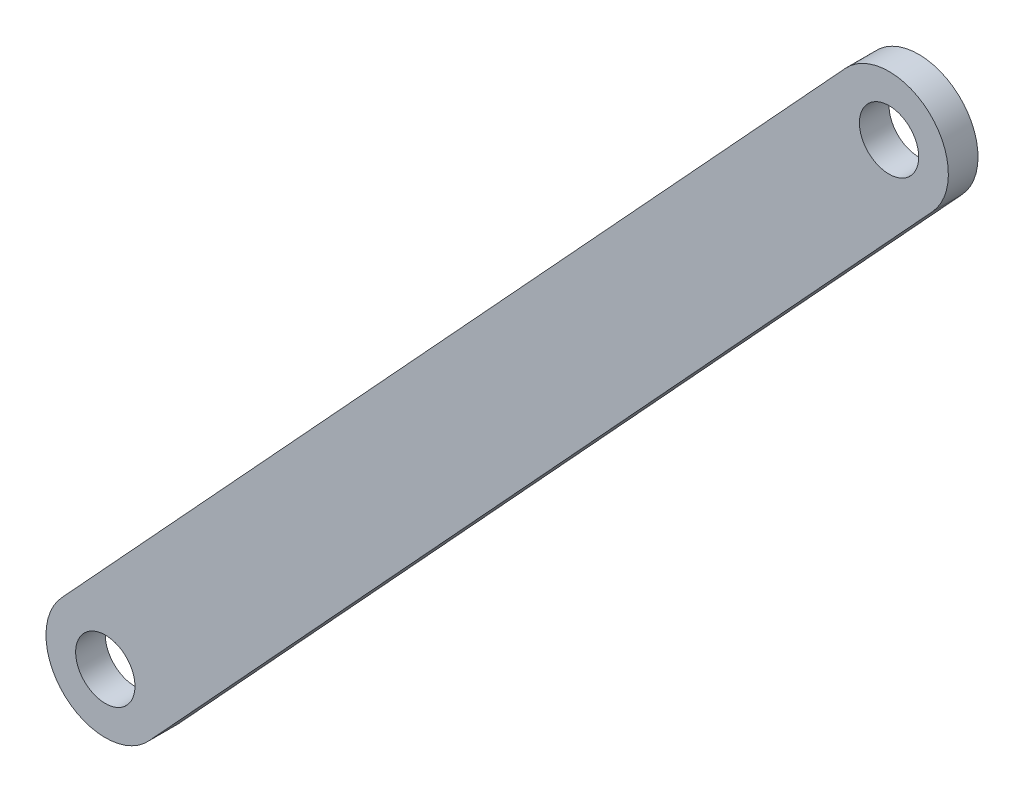
ISO-10303-21;
HEADER;
FILE_DESCRIPTION(('STEP AP214'),'2;1');
FILE_NAME('part.step','',(''),(''),'','','');
FILE_SCHEMA(('AUTOMOTIVE_DESIGN { 1 0 10303 214 1 1 1 1 }'));
ENDSEC;
DATA;
#1=APPLICATION_CONTEXT('core data for automotive mechanical design processes');
#2=APPLICATION_PROTOCOL_DEFINITION('international standard','automotive_design',2000,#1);
#3=PRODUCT_CONTEXT('',#1,'mechanical');
#4=PRODUCT('Part','Part','',(#3));
#5=PRODUCT_RELATED_PRODUCT_CATEGORY('part','',(#4));
#6=PRODUCT_DEFINITION_FORMATION('','',#4);
#7=PRODUCT_DEFINITION_CONTEXT('part definition',#1,'design');
#8=PRODUCT_DEFINITION('design','',#6,#7);
#9=PRODUCT_DEFINITION_SHAPE('','',#8);
#10=(LENGTH_UNIT() NAMED_UNIT(*) SI_UNIT(.MILLI.,.METRE.));
#11=(NAMED_UNIT(*) PLANE_ANGLE_UNIT() SI_UNIT($,.RADIAN.));
#12=(NAMED_UNIT(*) SI_UNIT($,.STERADIAN.) SOLID_ANGLE_UNIT());
#13=UNCERTAINTY_MEASURE_WITH_UNIT(LENGTH_MEASURE(1.E-05),#10,'distance_accuracy_value','');
#14=(GEOMETRIC_REPRESENTATION_CONTEXT(3) GLOBAL_UNCERTAINTY_ASSIGNED_CONTEXT((#13)) GLOBAL_UNIT_ASSIGNED_CONTEXT((#10,
#11,#12)) REPRESENTATION_CONTEXT('',''));
#15=CARTESIAN_POINT('',(0.,0.,0.));
#16=DIRECTION('',(0.,0.,1.));
#17=DIRECTION('',(1.,0.,0.));
#18=AXIS2_PLACEMENT_3D('',#15,#16,#17);
#19=CARTESIAN_POINT('',(15.,0.,3.175));
#20=DIRECTION('',(0.,0.,1.));
#21=DIRECTION('',(1.,0.,0.));
#22=AXIS2_PLACEMENT_3D('',#19,#20,#21);
#23=PLANE('',#22);
#24=CARTESIAN_POINT('',(-26.9521070315729,-45.5151701700811,3.175));
#25=DIRECTION('',(0.,0.,1.));
#26=DIRECTION('',(1.,0.,0.));
#27=AXIS2_PLACEMENT_3D('',#24,#25,#26);
#28=CIRCLE('',#27,1.5875);
#29=CARTESIAN_POINT('',(-25.3646070315729,-45.5151701700811,3.175));
#30=VERTEX_POINT('',#29);
#31=EDGE_CURVE('E101',#30,#30,#28,.T.);
#32=ORIENTED_EDGE('',*,*,#31,.F.);
#33=EDGE_LOOP('',(#32));
#34=FACE_BOUND('',#33,.T.);
#35=CARTESIAN_POINT('',(15.,0.,3.175));
#36=DIRECTION('',(0.,0.,1.));
#37=DIRECTION('',(1.,0.,0.));
#38=AXIS2_PLACEMENT_3D('',#35,#36,#37);
#39=CIRCLE('',#38,3.175);
#40=CARTESIAN_POINT('',(17.3345826379646,-2.1518245529118,3.175));
#41=VERTEX_POINT('',#40);
#42=CARTESIAN_POINT('',(12.6654173620354,2.15182455291191,3.175));
#43=VERTEX_POINT('',#42);
#44=EDGE_CURVE('E86',#41,#43,#39,.T.);
#45=ORIENTED_EDGE('',*,*,#44,.T.);
#46=DIRECTION('',(-0.677740016665152,-0.735301618256562,0.));
#47=VECTOR('',#46,1.);
#48=CARTESIAN_POINT('',(12.6654173620354,2.15182455291191,3.175));
#49=LINE('',#48,#47);
#50=CARTESIAN_POINT('',(-29.2866896695375,-43.3633456171693,3.175));
#51=VERTEX_POINT('',#50);
#52=EDGE_CURVE('E81',#43,#51,#49,.T.);
#53=ORIENTED_EDGE('',*,*,#52,.T.);
#54=CARTESIAN_POINT('',(-26.9521070315729,-45.5151701700811,3.175));
#55=DIRECTION('',(0.,0.,1.));
#56=DIRECTION('',(1.,0.,0.));
#57=AXIS2_PLACEMENT_3D('',#54,#55,#56);
#58=CIRCLE('',#57,3.17499999999999);
#59=CARTESIAN_POINT('',(-24.6175243936083,-47.666994722993,3.175));
#60=VERTEX_POINT('',#59);
#61=EDGE_CURVE('E84',#51,#60,#58,.T.);
#62=ORIENTED_EDGE('',*,*,#61,.T.);
#63=DIRECTION('',(0.677740016665152,0.735301618256562,0.));
#64=VECTOR('',#63,1.);
#65=CARTESIAN_POINT('',(17.3345826379646,-2.1518245529118,3.175));
#66=LINE('',#65,#64);
#67=EDGE_CURVE('E51',#60,#41,#66,.T.);
#68=ORIENTED_EDGE('',*,*,#67,.T.);
#69=EDGE_LOOP('',(#45,#53,#62,#68));
#70=FACE_BOUND('',#69,.T.);
#71=CARTESIAN_POINT('',(15.,0.,3.175));
#72=DIRECTION('',(0.,0.,1.));
#73=DIRECTION('',(1.,0.,0.));
#74=AXIS2_PLACEMENT_3D('',#71,#72,#73);
#75=CIRCLE('',#74,1.5875);
#76=CARTESIAN_POINT('',(16.5875,0.,3.175));
#77=VERTEX_POINT('',#76);
#78=EDGE_CURVE('E116',#77,#77,#75,.T.);
#79=ORIENTED_EDGE('',*,*,#78,.F.);
#80=EDGE_LOOP('',(#79));
#81=FACE_BOUND('',#80,.T.);
#82=ADVANCED_FACE('F34',(#34,#70,#81),#23,.T.);
#83=CARTESIAN_POINT('',(15.,0.,1.5875));
#84=DIRECTION('',(0.,0.,1.));
#85=DIRECTION('',(1.,0.,0.));
#86=AXIS2_PLACEMENT_3D('',#83,#84,#85);
#87=PLANE('',#86);
#88=CARTESIAN_POINT('',(-26.9521070315729,-45.5151701700811,1.5875));
#89=DIRECTION('',(0.,0.,1.));
#90=DIRECTION('',(1.,0.,0.));
#91=AXIS2_PLACEMENT_3D('',#88,#89,#90);
#92=CIRCLE('',#91,1.5875);
#93=CARTESIAN_POINT('',(-25.3646070315729,-45.5151701700811,1.5875));
#94=VERTEX_POINT('',#93);
#95=EDGE_CURVE('E113',#94,#94,#92,.T.);
#96=ORIENTED_EDGE('',*,*,#95,.T.);
#97=EDGE_LOOP('',(#96));
#98=FACE_BOUND('',#97,.T.);
#99=CARTESIAN_POINT('',(15.,0.,1.5875));
#100=DIRECTION('',(0.,0.,1.));
#101=DIRECTION('',(1.,0.,0.));
#102=AXIS2_PLACEMENT_3D('',#99,#100,#101);
#103=CIRCLE('',#102,3.175);
#104=CARTESIAN_POINT('',(17.3345826379646,-2.1518245529118,1.5875));
#105=VERTEX_POINT('',#104);
#106=CARTESIAN_POINT('',(12.6654173620354,2.15182455291191,1.5875));
#107=VERTEX_POINT('',#106);
#108=EDGE_CURVE('E98',#105,#107,#103,.T.);
#109=ORIENTED_EDGE('',*,*,#108,.F.);
#110=DIRECTION('',(0.677740016665152,0.735301618256562,0.));
#111=VECTOR('',#110,1.);
#112=CARTESIAN_POINT('',(17.3345826379646,-2.1518245529118,1.5875));
#113=LINE('',#112,#111);
#114=CARTESIAN_POINT('',(-24.6175243936083,-47.666994722993,1.5875));
#115=VERTEX_POINT('',#114);
#116=EDGE_CURVE('E74',#115,#105,#113,.T.);
#117=ORIENTED_EDGE('',*,*,#116,.F.);
#118=CARTESIAN_POINT('',(-26.9521070315729,-45.5151701700811,1.5875));
#119=DIRECTION('',(0.,0.,1.));
#120=DIRECTION('',(1.,0.,0.));
#121=AXIS2_PLACEMENT_3D('',#118,#119,#120);
#122=CIRCLE('',#121,3.17499999999999);
#123=CARTESIAN_POINT('',(-29.2866896695375,-43.3633456171693,1.5875));
#124=VERTEX_POINT('',#123);
#125=EDGE_CURVE('E68',#124,#115,#122,.T.);
#126=ORIENTED_EDGE('',*,*,#125,.F.);
#127=DIRECTION('',(-0.677740016665152,-0.735301618256562,0.));
#128=VECTOR('',#127,1.);
#129=CARTESIAN_POINT('',(12.6654173620354,2.15182455291191,1.5875));
#130=LINE('',#129,#128);
#131=EDGE_CURVE('E90',#107,#124,#130,.T.);
#132=ORIENTED_EDGE('',*,*,#131,.F.);
#133=EDGE_LOOP('',(#109,#117,#126,#132));
#134=FACE_BOUND('',#133,.T.);
#135=CARTESIAN_POINT('',(15.,0.,1.5875));
#136=DIRECTION('',(0.,0.,1.));
#137=DIRECTION('',(1.,0.,0.));
#138=AXIS2_PLACEMENT_3D('',#135,#136,#137);
#139=CIRCLE('',#138,1.5875);
#140=CARTESIAN_POINT('',(16.5875,0.,1.5875));
#141=VERTEX_POINT('',#140);
#142=EDGE_CURVE('E119',#141,#141,#139,.T.);
#143=ORIENTED_EDGE('',*,*,#142,.T.);
#144=EDGE_LOOP('',(#143));
#145=FACE_BOUND('',#144,.T.);
#146=ADVANCED_FACE('F109',(#98,#134,#145),#87,.F.);
#147=CARTESIAN_POINT('',(15.,0.,3.175));
#148=DIRECTION('',(0.,0.,-1.));
#149=DIRECTION('',(-1.,0.,0.));
#150=AXIS2_PLACEMENT_3D('',#147,#148,#149);
#151=CYLINDRICAL_SURFACE('',#150,3.175);
#152=ORIENTED_EDGE('',*,*,#108,.T.);
#153=DIRECTION('',(0.,0.,-1.));
#154=VECTOR('',#153,1.);
#155=CARTESIAN_POINT('',(12.6654173620354,2.15182455291191,3.175));
#156=LINE('',#155,#154);
#157=EDGE_CURVE('E11',#43,#107,#156,.T.);
#158=ORIENTED_EDGE('',*,*,#157,.F.);
#159=ORIENTED_EDGE('',*,*,#44,.F.);
#160=DIRECTION('',(0.,0.,-1.));
#161=VECTOR('',#160,1.);
#162=CARTESIAN_POINT('',(17.3345826379646,-2.1518245529118,3.175));
#163=LINE('',#162,#161);
#164=EDGE_CURVE('E94',#41,#105,#163,.T.);
#165=ORIENTED_EDGE('',*,*,#164,.T.);
#166=EDGE_LOOP('',(#152,#158,#159,#165));
#167=FACE_BOUND('',#166,.T.);
#168=ADVANCED_FACE('F36',(#167),#151,.T.);
#169=CARTESIAN_POINT('',(12.6654173620354,2.15182455291191,3.175));
#170=DIRECTION('',(0.735301618256562,-0.677740016665152,0.));
#171=DIRECTION('',(0.677740016665152,0.735301618256562,0.));
#172=AXIS2_PLACEMENT_3D('',#169,#170,#171);
#173=PLANE('',#172);
#174=ORIENTED_EDGE('',*,*,#131,.T.);
#175=DIRECTION('',(0.,0.,-1.));
#176=VECTOR('',#175,1.);
#177=CARTESIAN_POINT('',(-29.2866896695375,-43.3633456171693,3.175));
#178=LINE('',#177,#176);
#179=EDGE_CURVE('E43',#51,#124,#178,.T.);
#180=ORIENTED_EDGE('',*,*,#179,.F.);
#181=ORIENTED_EDGE('',*,*,#52,.F.);
#182=ORIENTED_EDGE('',*,*,#157,.T.);
#183=EDGE_LOOP('',(#174,#180,#181,#182));
#184=FACE_BOUND('',#183,.T.);
#185=ADVANCED_FACE('F89',(#184),#173,.F.);
#186=CARTESIAN_POINT('',(-26.9521070315729,-45.5151701700811,3.175));
#187=DIRECTION('',(0.,0.,-1.));
#188=DIRECTION('',(-1.,0.,0.));
#189=AXIS2_PLACEMENT_3D('',#186,#187,#188);
#190=CYLINDRICAL_SURFACE('',#189,3.17499999999999);
#191=ORIENTED_EDGE('',*,*,#125,.T.);
#192=DIRECTION('',(0.,0.,-1.));
#193=VECTOR('',#192,1.);
#194=CARTESIAN_POINT('',(-24.6175243936083,-47.666994722993,3.175));
#195=LINE('',#194,#193);
#196=EDGE_CURVE('E91',#60,#115,#195,.T.);
#197=ORIENTED_EDGE('',*,*,#196,.F.);
#198=ORIENTED_EDGE('',*,*,#61,.F.);
#199=ORIENTED_EDGE('',*,*,#179,.T.);
#200=EDGE_LOOP('',(#191,#197,#198,#199));
#201=FACE_BOUND('',#200,.T.);
#202=ADVANCED_FACE('F92',(#201),#190,.T.);
#203=CARTESIAN_POINT('',(17.3345826379646,-2.1518245529118,3.175));
#204=DIRECTION('',(-0.735301618256562,0.677740016665152,0.));
#205=DIRECTION('',(-0.677740016665152,-0.735301618256562,0.));
#206=AXIS2_PLACEMENT_3D('',#203,#204,#205);
#207=PLANE('',#206);
#208=ORIENTED_EDGE('',*,*,#116,.T.);
#209=ORIENTED_EDGE('',*,*,#164,.F.);
#210=ORIENTED_EDGE('',*,*,#67,.F.);
#211=ORIENTED_EDGE('',*,*,#196,.T.);
#212=EDGE_LOOP('',(#208,#209,#210,#211));
#213=FACE_BOUND('',#212,.T.);
#214=ADVANCED_FACE('F106',(#213),#207,.F.);
#215=CARTESIAN_POINT('',(-26.9521070315729,-45.5151701700811,3.175));
#216=DIRECTION('',(0.,0.,-1.));
#217=DIRECTION('',(-1.,0.,0.));
#218=AXIS2_PLACEMENT_3D('',#215,#216,#217);
#219=CYLINDRICAL_SURFACE('',#218,1.5875);
#220=ORIENTED_EDGE('',*,*,#31,.T.);
#221=EDGE_LOOP('',(#220));
#222=FACE_BOUND('',#221,.T.);
#223=ORIENTED_EDGE('',*,*,#95,.F.);
#224=EDGE_LOOP('',(#223));
#225=FACE_BOUND('',#224,.T.);
#226=ADVANCED_FACE('F137',(#222,#225),#219,.F.);
#227=CARTESIAN_POINT('',(15.,0.,3.175));
#228=DIRECTION('',(0.,0.,-1.));
#229=DIRECTION('',(-1.,0.,0.));
#230=AXIS2_PLACEMENT_3D('',#227,#228,#229);
#231=CYLINDRICAL_SURFACE('',#230,1.5875);
#232=ORIENTED_EDGE('',*,*,#78,.T.);
#233=EDGE_LOOP('',(#232));
#234=FACE_BOUND('',#233,.T.);
#235=ORIENTED_EDGE('',*,*,#142,.F.);
#236=EDGE_LOOP('',(#235));
#237=FACE_BOUND('',#236,.T.);
#238=ADVANCED_FACE('F125',(#234,#237),#231,.F.);
#239=CLOSED_SHELL('',(#82,#146,#168,#185,#202,#214,#226,#238));
#240=MANIFOLD_SOLID_BREP('B2',#239);
#241=ADVANCED_BREP_SHAPE_REPRESENTATION('',(#18,#240),#14);
#242=SHAPE_DEFINITION_REPRESENTATION(#9,#241);
ENDSEC;
END-ISO-10303-21;
